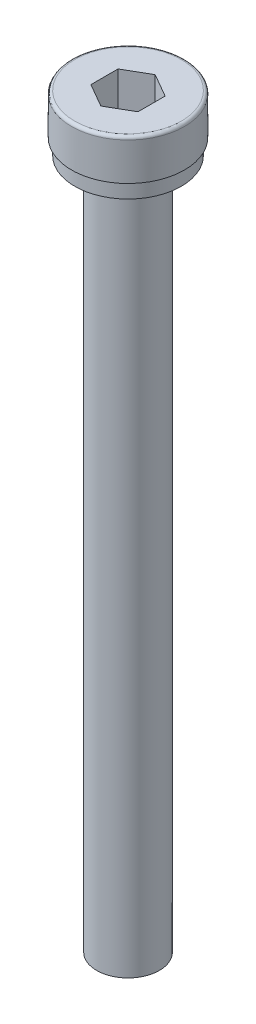
ISO-10303-21;
HEADER;
FILE_DESCRIPTION(('STEP AP214'),'2;1');
FILE_NAME('part.step','',(''),(''),'','','');
FILE_SCHEMA(('AUTOMOTIVE_DESIGN { 1 0 10303 214 1 1 1 1 }'));
ENDSEC;
DATA;
#1=APPLICATION_CONTEXT('core data for automotive mechanical design processes');
#2=APPLICATION_PROTOCOL_DEFINITION('international standard','automotive_design',2000,#1);
#3=PRODUCT_CONTEXT('',#1,'mechanical');
#4=PRODUCT('Part','Part','',(#3));
#5=PRODUCT_RELATED_PRODUCT_CATEGORY('part','',(#4));
#6=PRODUCT_DEFINITION_FORMATION('','',#4);
#7=PRODUCT_DEFINITION_CONTEXT('part definition',#1,'design');
#8=PRODUCT_DEFINITION('design','',#6,#7);
#9=PRODUCT_DEFINITION_SHAPE('','',#8);
#10=(LENGTH_UNIT() NAMED_UNIT(*) SI_UNIT(.MILLI.,.METRE.));
#11=(NAMED_UNIT(*) PLANE_ANGLE_UNIT() SI_UNIT($,.RADIAN.));
#12=(NAMED_UNIT(*) SI_UNIT($,.STERADIAN.) SOLID_ANGLE_UNIT());
#13=UNCERTAINTY_MEASURE_WITH_UNIT(LENGTH_MEASURE(1.E-05),#10,'distance_accuracy_value','');
#14=(GEOMETRIC_REPRESENTATION_CONTEXT(3) GLOBAL_UNCERTAINTY_ASSIGNED_CONTEXT((#13)) GLOBAL_UNIT_ASSIGNED_CONTEXT((#10,
#11,#12)) REPRESENTATION_CONTEXT('',''));
#15=CARTESIAN_POINT('',(0.,0.,0.));
#16=DIRECTION('',(0.,0.,1.));
#17=DIRECTION('',(1.,0.,0.));
#18=AXIS2_PLACEMENT_3D('',#15,#16,#17);
#19=CARTESIAN_POINT('',(0.,0.,0.));
#20=DIRECTION('',(0.,-1.,0.));
#21=DIRECTION('',(0.,0.,-1.));
#22=AXIS2_PLACEMENT_3D('',#19,#20,#21);
#23=CYLINDRICAL_SURFACE('',#22,1.8);
#24=CARTESIAN_POINT('',(0.,-0.1,0.));
#25=DIRECTION('',(0.,1.,0.));
#26=DIRECTION('',(0.,0.,1.));
#27=AXIS2_PLACEMENT_3D('',#24,#25,#26);
#28=CIRCLE('',#27,1.8);
#29=CARTESIAN_POINT('',(0.,-0.1,1.8));
#30=VERTEX_POINT('',#29);
#31=EDGE_CURVE('E47',#30,#30,#28,.F.);
#32=ORIENTED_EDGE('',*,*,#31,.T.);
#33=EDGE_LOOP('',(#32));
#34=FACE_BOUND('',#33,.T.);
#35=CARTESIAN_POINT('',(0.,-1.3,0.));
#36=DIRECTION('',(0.,-1.,0.));
#37=DIRECTION('',(0.,0.,-1.));
#38=AXIS2_PLACEMENT_3D('',#35,#36,#37);
#39=CIRCLE('',#38,1.8);
#40=CARTESIAN_POINT('',(0.,-1.3,-1.8));
#41=VERTEX_POINT('',#40);
#42=EDGE_CURVE('E134',#41,#41,#39,.T.);
#43=ORIENTED_EDGE('',*,*,#42,.F.);
#44=EDGE_LOOP('',(#43));
#45=FACE_BOUND('',#44,.T.);
#46=ADVANCED_FACE('F41',(#34,#45),#23,.T.);
#47=CARTESIAN_POINT('',(0.,0.,-1.8));
#48=DIRECTION('',(0.,1.,0.));
#49=DIRECTION('',(0.,0.,1.));
#50=AXIS2_PLACEMENT_3D('',#47,#48,#49);
#51=PLANE('',#50);
#52=CARTESIAN_POINT('',(0.,0.,0.));
#53=DIRECTION('',(0.,1.,0.));
#54=DIRECTION('',(0.,0.,1.));
#55=AXIS2_PLACEMENT_3D('',#52,#53,#54);
#56=CIRCLE('',#55,1.7);
#57=CARTESIAN_POINT('',(0.,0.,1.7));
#58=VERTEX_POINT('',#57);
#59=EDGE_CURVE('E11',#58,#58,#56,.T.);
#60=ORIENTED_EDGE('',*,*,#59,.T.);
#61=EDGE_LOOP('',(#60));
#62=FACE_BOUND('',#61,.T.);
#63=DIRECTION('',(-0.866025403784439,0.,-0.5));
#64=VECTOR('',#63,1.);
#65=CARTESIAN_POINT('',(0.749999999999999,0.,-0.43301270189222));
#66=LINE('',#65,#64);
#67=CARTESIAN_POINT('',(0.749999999999999,0.,-0.43301270189222));
#68=VERTEX_POINT('',#67);
#69=CARTESIAN_POINT('',(0.,0.,-0.866025403784438));
#70=VERTEX_POINT('',#69);
#71=EDGE_CURVE('E57',#68,#70,#66,.T.);
#72=ORIENTED_EDGE('',*,*,#71,.F.);
#73=DIRECTION('',(0.,0.,-1.));
#74=VECTOR('',#73,1.);
#75=CARTESIAN_POINT('',(0.749999999999999,0.,0.433012701892219));
#76=LINE('',#75,#74);
#77=CARTESIAN_POINT('',(0.749999999999999,0.,0.433012701892219));
#78=VERTEX_POINT('',#77);
#79=EDGE_CURVE('E139',#78,#68,#76,.T.);
#80=ORIENTED_EDGE('',*,*,#79,.F.);
#81=DIRECTION('',(0.866025403784439,0.,-0.5));
#82=VECTOR('',#81,1.);
#83=CARTESIAN_POINT('',(0.,0.,0.866025403784438));
#84=LINE('',#83,#82);
#85=CARTESIAN_POINT('',(0.,0.,0.866025403784438));
#86=VERTEX_POINT('',#85);
#87=EDGE_CURVE('E138',#86,#78,#84,.T.);
#88=ORIENTED_EDGE('',*,*,#87,.F.);
#89=DIRECTION('',(0.866025403784439,0.,0.5));
#90=VECTOR('',#89,1.);
#91=CARTESIAN_POINT('',(-0.75,0.,0.433012701892219));
#92=LINE('',#91,#90);
#93=CARTESIAN_POINT('',(-0.75,0.,0.433012701892219));
#94=VERTEX_POINT('',#93);
#95=EDGE_CURVE('E102',#94,#86,#92,.T.);
#96=ORIENTED_EDGE('',*,*,#95,.F.);
#97=DIRECTION('',(0.,0.,1.));
#98=VECTOR('',#97,1.);
#99=CARTESIAN_POINT('',(-0.75,0.,-0.43301270189222));
#100=LINE('',#99,#98);
#101=CARTESIAN_POINT('',(-0.75,0.,-0.43301270189222));
#102=VERTEX_POINT('',#101);
#103=EDGE_CURVE('E133',#102,#94,#100,.T.);
#104=ORIENTED_EDGE('',*,*,#103,.F.);
#105=DIRECTION('',(-0.866025403784439,0.,0.5));
#106=VECTOR('',#105,1.);
#107=CARTESIAN_POINT('',(0.,0.,-0.866025403784438));
#108=LINE('',#107,#106);
#109=EDGE_CURVE('E128',#70,#102,#108,.T.);
#110=ORIENTED_EDGE('',*,*,#109,.F.);
#111=EDGE_LOOP('',(#72,#80,#88,#96,#104,#110));
#112=FACE_BOUND('',#111,.T.);
#113=ADVANCED_FACE('F173',(#62,#112),#51,.T.);
#114=CARTESIAN_POINT('',(0.749999999999999,-1.3,-0.43301270189222));
#115=DIRECTION('',(0.5,0.,-0.866025403784439));
#116=DIRECTION('',(-0.866025403784439,0.,-0.5));
#117=AXIS2_PLACEMENT_3D('',#114,#115,#116);
#118=PLANE('',#117);
#119=ORIENTED_EDGE('',*,*,#71,.T.);
#120=DIRECTION('',(0.,1.,0.));
#121=VECTOR('',#120,1.);
#122=CARTESIAN_POINT('',(0.,-1.3,-0.866025403784438));
#123=LINE('',#122,#121);
#124=CARTESIAN_POINT('',(0.,-1.3,-0.866025403784438));
#125=VERTEX_POINT('',#124);
#126=EDGE_CURVE('E88',#125,#70,#123,.T.);
#127=ORIENTED_EDGE('',*,*,#126,.F.);
#128=DIRECTION('',(-0.866025403784439,0.,-0.5));
#129=VECTOR('',#128,1.);
#130=CARTESIAN_POINT('',(0.749999999999999,-1.3,-0.43301270189222));
#131=LINE('',#130,#129);
#132=CARTESIAN_POINT('',(0.749999999999999,-1.3,-0.43301270189222));
#133=VERTEX_POINT('',#132);
#134=EDGE_CURVE('E142',#133,#125,#131,.T.);
#135=ORIENTED_EDGE('',*,*,#134,.F.);
#136=DIRECTION('',(0.,1.,0.));
#137=VECTOR('',#136,1.);
#138=CARTESIAN_POINT('',(0.749999999999999,-1.3,-0.43301270189222));
#139=LINE('',#138,#137);
#140=EDGE_CURVE('E63',#133,#68,#139,.T.);
#141=ORIENTED_EDGE('',*,*,#140,.T.);
#142=EDGE_LOOP('',(#119,#127,#135,#141));
#143=FACE_BOUND('',#142,.T.);
#144=ADVANCED_FACE('F178',(#143),#118,.F.);
#145=CARTESIAN_POINT('',(0.749999999999999,-1.3,0.433012701892219));
#146=DIRECTION('',(1.,0.,0.));
#147=DIRECTION('',(0.,0.,-1.));
#148=AXIS2_PLACEMENT_3D('',#145,#146,#147);
#149=PLANE('',#148);
#150=ORIENTED_EDGE('',*,*,#79,.T.);
#151=ORIENTED_EDGE('',*,*,#140,.F.);
#152=DIRECTION('',(0.,0.,-1.));
#153=VECTOR('',#152,1.);
#154=CARTESIAN_POINT('',(0.749999999999999,-1.3,0.433012701892219));
#155=LINE('',#154,#153);
#156=CARTESIAN_POINT('',(0.749999999999999,-1.3,0.433012701892219));
#157=VERTEX_POINT('',#156);
#158=EDGE_CURVE('E119',#157,#133,#155,.T.);
#159=ORIENTED_EDGE('',*,*,#158,.F.);
#160=DIRECTION('',(0.,1.,0.));
#161=VECTOR('',#160,1.);
#162=CARTESIAN_POINT('',(0.749999999999999,-1.3,0.433012701892219));
#163=LINE('',#162,#161);
#164=EDGE_CURVE('E107',#157,#78,#163,.T.);
#165=ORIENTED_EDGE('',*,*,#164,.T.);
#166=EDGE_LOOP('',(#150,#151,#159,#165));
#167=FACE_BOUND('',#166,.T.);
#168=ADVANCED_FACE('F206',(#167),#149,.F.);
#169=CARTESIAN_POINT('',(0.,-1.3,0.866025403784438));
#170=DIRECTION('',(0.5,0.,0.866025403784439));
#171=DIRECTION('',(0.866025403784439,0.,-0.5));
#172=AXIS2_PLACEMENT_3D('',#169,#170,#171);
#173=PLANE('',#172);
#174=ORIENTED_EDGE('',*,*,#87,.T.);
#175=ORIENTED_EDGE('',*,*,#164,.F.);
#176=DIRECTION('',(0.866025403784439,0.,-0.5));
#177=VECTOR('',#176,1.);
#178=CARTESIAN_POINT('',(0.,-1.3,0.866025403784438));
#179=LINE('',#178,#177);
#180=CARTESIAN_POINT('',(0.,-1.3,0.866025403784438));
#181=VERTEX_POINT('',#180);
#182=EDGE_CURVE('E115',#181,#157,#179,.T.);
#183=ORIENTED_EDGE('',*,*,#182,.F.);
#184=DIRECTION('',(0.,1.,0.));
#185=VECTOR('',#184,1.);
#186=CARTESIAN_POINT('',(0.,-1.3,0.866025403784438));
#187=LINE('',#186,#185);
#188=EDGE_CURVE('E100',#181,#86,#187,.T.);
#189=ORIENTED_EDGE('',*,*,#188,.T.);
#190=EDGE_LOOP('',(#174,#175,#183,#189));
#191=FACE_BOUND('',#190,.T.);
#192=ADVANCED_FACE('F114',(#191),#173,.F.);
#193=CARTESIAN_POINT('',(-0.75,-1.3,0.433012701892219));
#194=DIRECTION('',(-0.5,0.,0.866025403784439));
#195=DIRECTION('',(0.866025403784439,0.,0.5));
#196=AXIS2_PLACEMENT_3D('',#193,#194,#195);
#197=PLANE('',#196);
#198=ORIENTED_EDGE('',*,*,#95,.T.);
#199=ORIENTED_EDGE('',*,*,#188,.F.);
#200=DIRECTION('',(0.866025403784439,0.,0.5));
#201=VECTOR('',#200,1.);
#202=CARTESIAN_POINT('',(-0.75,-1.3,0.433012701892219));
#203=LINE('',#202,#201);
#204=CARTESIAN_POINT('',(-0.75,-1.3,0.433012701892219));
#205=VERTEX_POINT('',#204);
#206=EDGE_CURVE('E101',#205,#181,#203,.T.);
#207=ORIENTED_EDGE('',*,*,#206,.F.);
#208=DIRECTION('',(0.,1.,0.));
#209=VECTOR('',#208,1.);
#210=CARTESIAN_POINT('',(-0.75,-1.3,0.433012701892219));
#211=LINE('',#210,#209);
#212=EDGE_CURVE('E108',#205,#94,#211,.T.);
#213=ORIENTED_EDGE('',*,*,#212,.T.);
#214=EDGE_LOOP('',(#198,#199,#207,#213));
#215=FACE_BOUND('',#214,.T.);
#216=ADVANCED_FACE('F97',(#215),#197,.F.);
#217=CARTESIAN_POINT('',(-0.75,-1.3,-0.43301270189222));
#218=DIRECTION('',(-1.,0.,0.));
#219=DIRECTION('',(0.,0.,1.));
#220=AXIS2_PLACEMENT_3D('',#217,#218,#219);
#221=PLANE('',#220);
#222=ORIENTED_EDGE('',*,*,#103,.T.);
#223=ORIENTED_EDGE('',*,*,#212,.F.);
#224=DIRECTION('',(0.,0.,1.));
#225=VECTOR('',#224,1.);
#226=CARTESIAN_POINT('',(-0.75,-1.3,-0.43301270189222));
#227=LINE('',#226,#225);
#228=CARTESIAN_POINT('',(-0.75,-1.3,-0.43301270189222));
#229=VERTEX_POINT('',#228);
#230=EDGE_CURVE('E125',#229,#205,#227,.T.);
#231=ORIENTED_EDGE('',*,*,#230,.F.);
#232=DIRECTION('',(0.,1.,0.));
#233=VECTOR('',#232,1.);
#234=CARTESIAN_POINT('',(-0.75,-1.3,-0.43301270189222));
#235=LINE('',#234,#233);
#236=EDGE_CURVE('E150',#229,#102,#235,.T.);
#237=ORIENTED_EDGE('',*,*,#236,.T.);
#238=EDGE_LOOP('',(#222,#223,#231,#237));
#239=FACE_BOUND('',#238,.T.);
#240=ADVANCED_FACE('F213',(#239),#221,.F.);
#241=CARTESIAN_POINT('',(0.,-1.3,-0.866025403784438));
#242=DIRECTION('',(-0.5,0.,-0.866025403784439));
#243=DIRECTION('',(-0.866025403784439,0.,0.5));
#244=AXIS2_PLACEMENT_3D('',#241,#242,#243);
#245=PLANE('',#244);
#246=ORIENTED_EDGE('',*,*,#109,.T.);
#247=ORIENTED_EDGE('',*,*,#236,.F.);
#248=DIRECTION('',(-0.866025403784439,0.,0.5));
#249=VECTOR('',#248,1.);
#250=CARTESIAN_POINT('',(0.,-1.3,-0.866025403784438));
#251=LINE('',#250,#249);
#252=EDGE_CURVE('E122',#125,#229,#251,.T.);
#253=ORIENTED_EDGE('',*,*,#252,.F.);
#254=ORIENTED_EDGE('',*,*,#126,.T.);
#255=EDGE_LOOP('',(#246,#247,#253,#254));
#256=FACE_BOUND('',#255,.T.);
#257=ADVANCED_FACE('F174',(#256),#245,.F.);
#258=CARTESIAN_POINT('',(0.,-1.3,0.));
#259=DIRECTION('',(0.,1.,0.));
#260=DIRECTION('',(0.,0.,1.));
#261=AXIS2_PLACEMENT_3D('',#258,#259,#260);
#262=PLANE('',#261);
#263=ORIENTED_EDGE('',*,*,#134,.T.);
#264=ORIENTED_EDGE('',*,*,#252,.T.);
#265=ORIENTED_EDGE('',*,*,#230,.T.);
#266=ORIENTED_EDGE('',*,*,#206,.T.);
#267=ORIENTED_EDGE('',*,*,#182,.T.);
#268=ORIENTED_EDGE('',*,*,#158,.T.);
#269=EDGE_LOOP('',(#263,#264,#265,#266,#267,#268));
#270=FACE_BOUND('',#269,.T.);
#271=ADVANCED_FACE('F118',(#270),#262,.T.);
#272=CARTESIAN_POINT('',(0.,-0.1,0.));
#273=DIRECTION('',(0.,1.,0.));
#274=DIRECTION('',(0.,0.,1.));
#275=AXIS2_PLACEMENT_3D('',#272,#273,#274);
#276=TOROIDAL_SURFACE('',#275,1.7,0.1);
#277=ORIENTED_EDGE('',*,*,#59,.F.);
#278=EDGE_LOOP('',(#277));
#279=FACE_BOUND('',#278,.T.);
#280=ORIENTED_EDGE('',*,*,#31,.F.);
#281=EDGE_LOOP('',(#280));
#282=FACE_BOUND('',#281,.T.);
#283=ADVANCED_FACE('F43',(#279,#282),#276,.T.);
#284=CARTESIAN_POINT('',(0.,-1.3,0.));
#285=DIRECTION('',(0.,-1.,0.));
#286=DIRECTION('',(0.,0.,-1.));
#287=AXIS2_PLACEMENT_3D('',#284,#285,#286);
#288=PLANE('',#287);
#289=CARTESIAN_POINT('',(0.,-1.3,0.));
#290=DIRECTION('',(0.,-1.,0.));
#291=DIRECTION('',(0.,0.,-1.));
#292=AXIS2_PLACEMENT_3D('',#289,#290,#291);
#293=CIRCLE('',#292,1.7);
#294=CARTESIAN_POINT('',(0.,-1.3,-1.7));
#295=VERTEX_POINT('',#294);
#296=EDGE_CURVE('E230',#295,#295,#293,.T.);
#297=ORIENTED_EDGE('',*,*,#296,.F.);
#298=EDGE_LOOP('',(#297));
#299=FACE_BOUND('',#298,.T.);
#300=ORIENTED_EDGE('',*,*,#42,.T.);
#301=EDGE_LOOP('',(#300));
#302=FACE_BOUND('',#301,.T.);
#303=ADVANCED_FACE('F159',(#299,#302),#288,.T.);
#304=CARTESIAN_POINT('',(0.,-1.3,0.));
#305=DIRECTION('',(0.,-1.,0.));
#306=DIRECTION('',(0.,0.,-1.));
#307=AXIS2_PLACEMENT_3D('',#304,#305,#306);
#308=CYLINDRICAL_SURFACE('',#307,1.7);
#309=ORIENTED_EDGE('',*,*,#296,.T.);
#310=EDGE_LOOP('',(#309));
#311=FACE_BOUND('',#310,.T.);
#312=CARTESIAN_POINT('',(0.,-1.8,0.));
#313=DIRECTION('',(0.,-1.,0.));
#314=DIRECTION('',(0.,0.,-1.));
#315=AXIS2_PLACEMENT_3D('',#312,#313,#314);
#316=CIRCLE('',#315,1.7);
#317=CARTESIAN_POINT('',(0.,-1.8,-1.7));
#318=VERTEX_POINT('',#317);
#319=EDGE_CURVE('E228',#318,#318,#316,.T.);
#320=ORIENTED_EDGE('',*,*,#319,.F.);
#321=EDGE_LOOP('',(#320));
#322=FACE_BOUND('',#321,.T.);
#323=ADVANCED_FACE('F170',(#311,#322),#308,.T.);
#324=CARTESIAN_POINT('',(0.,-23.8,0.));
#325=DIRECTION('',(0.,-1.,0.));
#326=DIRECTION('',(0.,0.,-1.));
#327=AXIS2_PLACEMENT_3D('',#324,#325,#326);
#328=PLANE('',#327);
#329=CARTESIAN_POINT('',(0.,-23.8,0.));
#330=DIRECTION('',(0.,-1.,0.));
#331=DIRECTION('',(0.,0.,-1.));
#332=AXIS2_PLACEMENT_3D('',#329,#330,#331);
#333=CIRCLE('',#332,1.);
#334=CARTESIAN_POINT('',(0.,-23.8,-1.));
#335=VERTEX_POINT('',#334);
#336=EDGE_CURVE('E155',#335,#335,#333,.T.);
#337=ORIENTED_EDGE('',*,*,#336,.T.);
#338=EDGE_LOOP('',(#337));
#339=FACE_BOUND('',#338,.T.);
#340=ADVANCED_FACE('F187',(#339),#328,.T.);
#341=CARTESIAN_POINT('',(0.,0.,0.));
#342=DIRECTION('',(0.,-1.,0.));
#343=DIRECTION('',(0.,0.,-1.));
#344=AXIS2_PLACEMENT_3D('',#341,#342,#343);
#345=CYLINDRICAL_SURFACE('',#344,1.);
#346=CARTESIAN_POINT('',(0.,-1.8,0.));
#347=DIRECTION('',(0.,-1.,0.));
#348=DIRECTION('',(0.,0.,-1.));
#349=AXIS2_PLACEMENT_3D('',#346,#347,#348);
#350=CIRCLE('',#349,1.);
#351=CARTESIAN_POINT('',(0.,-1.8,-1.));
#352=VERTEX_POINT('',#351);
#353=EDGE_CURVE('E145',#352,#352,#350,.T.);
#354=ORIENTED_EDGE('',*,*,#353,.T.);
#355=EDGE_LOOP('',(#354));
#356=FACE_BOUND('',#355,.T.);
#357=ORIENTED_EDGE('',*,*,#336,.F.);
#358=EDGE_LOOP('',(#357));
#359=FACE_BOUND('',#358,.T.);
#360=ADVANCED_FACE('F189',(#356,#359),#345,.T.);
#361=CARTESIAN_POINT('',(0.,-1.8,-1.));
#362=DIRECTION('',(0.,-1.,0.));
#363=DIRECTION('',(0.,0.,-1.));
#364=AXIS2_PLACEMENT_3D('',#361,#362,#363);
#365=PLANE('',#364);
#366=ORIENTED_EDGE('',*,*,#353,.F.);
#367=EDGE_LOOP('',(#366));
#368=FACE_BOUND('',#367,.T.);
#369=ORIENTED_EDGE('',*,*,#319,.T.);
#370=EDGE_LOOP('',(#369));
#371=FACE_BOUND('',#370,.T.);
#372=ADVANCED_FACE('F181',(#368,#371),#365,.T.);
#373=CLOSED_SHELL('',(#46,#113,#144,#168,#192,#216,#240,#257,#271,#283,#303,#323,#340,#360,#372));
#374=MANIFOLD_SOLID_BREP('B2',#373);
#375=ADVANCED_BREP_SHAPE_REPRESENTATION('',(#18,#374),#14);
#376=SHAPE_DEFINITION_REPRESENTATION(#9,#375);
ENDSEC;
END-ISO-10303-21;
